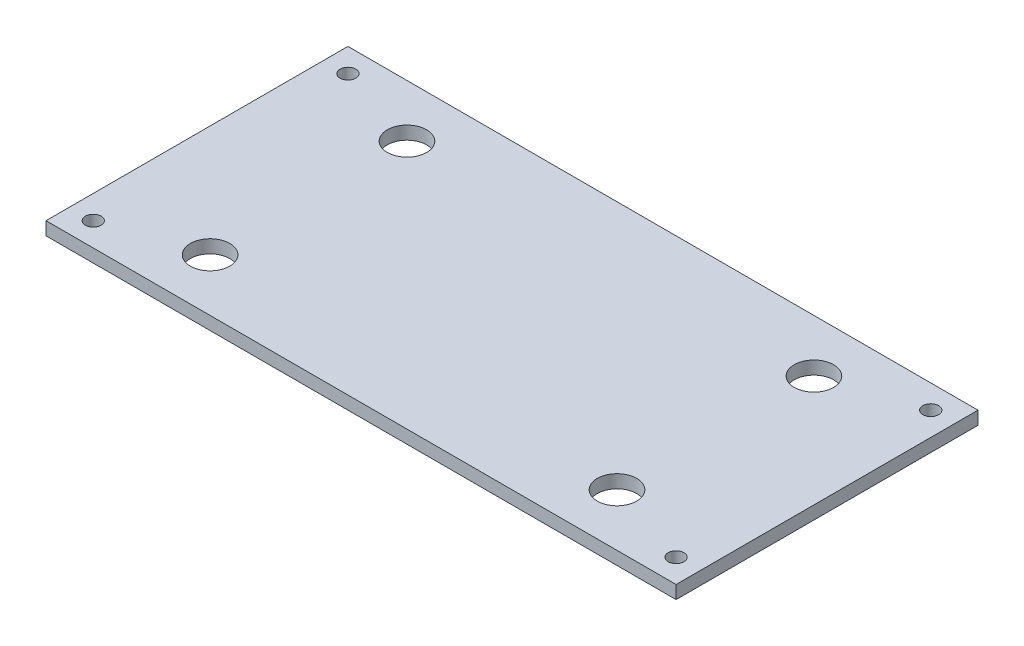
ISO-10303-21;
HEADER;
FILE_DESCRIPTION(('STEP AP214'),'2;1');
FILE_NAME('part.step','',(''),(''),'','','');
FILE_SCHEMA(('AUTOMOTIVE_DESIGN { 1 0 10303 214 1 1 1 1 }'));
ENDSEC;
DATA;
#1=APPLICATION_CONTEXT('core data for automotive mechanical design processes');
#2=APPLICATION_PROTOCOL_DEFINITION('international standard','automotive_design',2000,#1);
#3=PRODUCT_CONTEXT('',#1,'mechanical');
#4=PRODUCT('Part','Part','',(#3));
#5=PRODUCT_RELATED_PRODUCT_CATEGORY('part','',(#4));
#6=PRODUCT_DEFINITION_FORMATION('','',#4);
#7=PRODUCT_DEFINITION_CONTEXT('part definition',#1,'design');
#8=PRODUCT_DEFINITION('design','',#6,#7);
#9=PRODUCT_DEFINITION_SHAPE('','',#8);
#10=(LENGTH_UNIT() NAMED_UNIT(*) SI_UNIT(.MILLI.,.METRE.));
#11=(NAMED_UNIT(*) PLANE_ANGLE_UNIT() SI_UNIT($,.RADIAN.));
#12=(NAMED_UNIT(*) SI_UNIT($,.STERADIAN.) SOLID_ANGLE_UNIT());
#13=UNCERTAINTY_MEASURE_WITH_UNIT(LENGTH_MEASURE(1.E-05),#10,'distance_accuracy_value','');
#14=(GEOMETRIC_REPRESENTATION_CONTEXT(3) GLOBAL_UNCERTAINTY_ASSIGNED_CONTEXT((#13)) GLOBAL_UNIT_ASSIGNED_CONTEXT((#10,
#11,#12)) REPRESENTATION_CONTEXT('',''));
#15=CARTESIAN_POINT('',(0.,0.,0.));
#16=DIRECTION('',(0.,0.,1.));
#17=DIRECTION('',(1.,0.,0.));
#18=AXIS2_PLACEMENT_3D('',#15,#16,#17);
#19=CARTESIAN_POINT('',(0.,0.,0.));
#20=DIRECTION('',(0.,1.,0.));
#21=DIRECTION('',(0.,0.,1.));
#22=AXIS2_PLACEMENT_3D('',#19,#20,#21);
#23=PLANE('',#22);
#24=CARTESIAN_POINT('',(15.5,0.,-7.50000000000001));
#25=DIRECTION('',(0.,1.,0.));
#26=DIRECTION('',(0.,0.,1.));
#27=AXIS2_PLACEMENT_3D('',#24,#25,#26);
#28=CIRCLE('',#27,1.5);
#29=CARTESIAN_POINT('',(15.5,0.,-6.00000000000001));
#30=VERTEX_POINT('',#29);
#31=EDGE_CURVE('E130',#30,#30,#28,.T.);
#32=ORIENTED_EDGE('',*,*,#31,.T.);
#33=EDGE_LOOP('',(#32));
#34=FACE_BOUND('',#33,.T.);
#35=CARTESIAN_POINT('',(15.5000000000001,0.,7.50000000000001));
#36=DIRECTION('',(0.,1.,0.));
#37=DIRECTION('',(0.,0.,1.));
#38=AXIS2_PLACEMENT_3D('',#35,#36,#37);
#39=CIRCLE('',#38,1.5);
#40=CARTESIAN_POINT('',(15.5000000000001,0.,9.00000000000001));
#41=VERTEX_POINT('',#40);
#42=EDGE_CURVE('E212',#41,#41,#39,.T.);
#43=ORIENTED_EDGE('',*,*,#42,.T.);
#44=EDGE_LOOP('',(#43));
#45=FACE_BOUND('',#44,.T.);
#46=CARTESIAN_POINT('',(-15.4999999999999,0.,7.5));
#47=DIRECTION('',(0.,1.,0.));
#48=DIRECTION('',(0.,0.,1.));
#49=AXIS2_PLACEMENT_3D('',#46,#47,#48);
#50=CIRCLE('',#49,1.5);
#51=CARTESIAN_POINT('',(-15.4999999999999,0.,9.));
#52=VERTEX_POINT('',#51);
#53=EDGE_CURVE('E214',#52,#52,#50,.T.);
#54=ORIENTED_EDGE('',*,*,#53,.T.);
#55=EDGE_LOOP('',(#54));
#56=FACE_BOUND('',#55,.T.);
#57=CARTESIAN_POINT('',(-15.5,0.,-7.5));
#58=DIRECTION('',(0.,1.,0.));
#59=DIRECTION('',(0.,0.,1.));
#60=AXIS2_PLACEMENT_3D('',#57,#58,#59);
#61=CIRCLE('',#60,1.5);
#62=CARTESIAN_POINT('',(-15.5,0.,-6.));
#63=VERTEX_POINT('',#62);
#64=EDGE_CURVE('E121',#63,#63,#61,.T.);
#65=ORIENTED_EDGE('',*,*,#64,.T.);
#66=EDGE_LOOP('',(#65));
#67=FACE_BOUND('',#66,.T.);
#68=DIRECTION('',(1.,0.,0.));
#69=VECTOR('',#68,1.);
#70=CARTESIAN_POINT('',(24.,0.,-11.5));
#71=LINE('',#70,#69);
#72=CARTESIAN_POINT('',(-24.,0.,-11.5));
#73=VERTEX_POINT('',#72);
#74=CARTESIAN_POINT('',(24.,0.,-11.5));
#75=VERTEX_POINT('',#74);
#76=EDGE_CURVE('E111',#73,#75,#71,.T.);
#77=ORIENTED_EDGE('',*,*,#76,.T.);
#78=DIRECTION('',(0.,0.,1.));
#79=VECTOR('',#78,1.);
#80=CARTESIAN_POINT('',(24.,0.,11.5));
#81=LINE('',#80,#79);
#82=CARTESIAN_POINT('',(24.,0.,11.5));
#83=VERTEX_POINT('',#82);
#84=EDGE_CURVE('E87',#75,#83,#81,.T.);
#85=ORIENTED_EDGE('',*,*,#84,.T.);
#86=DIRECTION('',(-1.,0.,0.));
#87=VECTOR('',#86,1.);
#88=CARTESIAN_POINT('',(24.,0.,11.5));
#89=LINE('',#88,#87);
#90=CARTESIAN_POINT('',(-24.,0.,11.5));
#91=VERTEX_POINT('',#90);
#92=EDGE_CURVE('E70',#83,#91,#89,.T.);
#93=ORIENTED_EDGE('',*,*,#92,.T.);
#94=DIRECTION('',(0.,0.,-1.));
#95=VECTOR('',#94,1.);
#96=CARTESIAN_POINT('',(-24.,0.,11.5));
#97=LINE('',#96,#95);
#98=EDGE_CURVE('E75',#91,#73,#97,.T.);
#99=ORIENTED_EDGE('',*,*,#98,.T.);
#100=EDGE_LOOP('',(#77,#85,#93,#99));
#101=FACE_BOUND('',#100,.T.);
#102=CARTESIAN_POINT('',(-22.2,0.,-9.70000000000001));
#103=DIRECTION('',(0.,1.,0.));
#104=DIRECTION('',(0.,0.,1.));
#105=AXIS2_PLACEMENT_3D('',#102,#103,#104);
#106=CIRCLE('',#105,0.6);
#107=CARTESIAN_POINT('',(-22.2,0.,-9.10000000000001));
#108=VERTEX_POINT('',#107);
#109=EDGE_CURVE('E84',#108,#108,#106,.T.);
#110=ORIENTED_EDGE('',*,*,#109,.T.);
#111=EDGE_LOOP('',(#110));
#112=FACE_BOUND('',#111,.T.);
#113=CARTESIAN_POINT('',(-22.2,0.,9.70000000000001));
#114=DIRECTION('',(0.,1.,0.));
#115=DIRECTION('',(0.,0.,1.));
#116=AXIS2_PLACEMENT_3D('',#113,#114,#115);
#117=CIRCLE('',#116,0.6);
#118=CARTESIAN_POINT('',(-22.2,0.,10.3));
#119=VERTEX_POINT('',#118);
#120=EDGE_CURVE('E114',#119,#119,#117,.T.);
#121=ORIENTED_EDGE('',*,*,#120,.T.);
#122=EDGE_LOOP('',(#121));
#123=FACE_BOUND('',#122,.T.);
#124=CARTESIAN_POINT('',(22.2,0.,9.70000000000001));
#125=DIRECTION('',(0.,1.,0.));
#126=DIRECTION('',(0.,0.,1.));
#127=AXIS2_PLACEMENT_3D('',#124,#125,#126);
#128=CIRCLE('',#127,0.6);
#129=CARTESIAN_POINT('',(22.2,0.,10.3));
#130=VERTEX_POINT('',#129);
#131=EDGE_CURVE('E116',#130,#130,#128,.T.);
#132=ORIENTED_EDGE('',*,*,#131,.T.);
#133=EDGE_LOOP('',(#132));
#134=FACE_BOUND('',#133,.T.);
#135=CARTESIAN_POINT('',(22.2,0.,-9.7));
#136=DIRECTION('',(0.,1.,0.));
#137=DIRECTION('',(0.,0.,1.));
#138=AXIS2_PLACEMENT_3D('',#135,#136,#137);
#139=CIRCLE('',#138,0.6);
#140=CARTESIAN_POINT('',(22.2,0.,-9.1));
#141=VERTEX_POINT('',#140);
#142=EDGE_CURVE('E35',#141,#141,#139,.T.);
#143=ORIENTED_EDGE('',*,*,#142,.T.);
#144=EDGE_LOOP('',(#143));
#145=FACE_BOUND('',#144,.T.);
#146=ADVANCED_FACE('F32',(#34,#45,#56,#67,#101,#112,#123,#134,#145),#23,.F.);
#147=CARTESIAN_POINT('',(22.2,0.,-9.7));
#148=DIRECTION('',(0.,1.,0.));
#149=DIRECTION('',(0.,0.,1.));
#150=AXIS2_PLACEMENT_3D('',#147,#148,#149);
#151=CYLINDRICAL_SURFACE('',#150,0.6);
#152=CARTESIAN_POINT('',(22.2,1.,-9.7));
#153=DIRECTION('',(0.,1.,0.));
#154=DIRECTION('',(0.,0.,1.));
#155=AXIS2_PLACEMENT_3D('',#152,#153,#154);
#156=CIRCLE('',#155,0.6);
#157=CARTESIAN_POINT('',(22.2,1.,-9.1));
#158=VERTEX_POINT('',#157);
#159=EDGE_CURVE('E108',#158,#158,#156,.F.);
#160=ORIENTED_EDGE('',*,*,#159,.F.);
#161=EDGE_LOOP('',(#160));
#162=FACE_BOUND('',#161,.T.);
#163=ORIENTED_EDGE('',*,*,#142,.F.);
#164=EDGE_LOOP('',(#163));
#165=FACE_BOUND('',#164,.T.);
#166=ADVANCED_FACE('F173',(#162,#165),#151,.F.);
#167=CARTESIAN_POINT('',(22.2,0.,9.70000000000001));
#168=DIRECTION('',(0.,1.,0.));
#169=DIRECTION('',(0.,0.,1.));
#170=AXIS2_PLACEMENT_3D('',#167,#168,#169);
#171=CYLINDRICAL_SURFACE('',#170,0.6);
#172=CARTESIAN_POINT('',(22.2,1.,9.70000000000001));
#173=DIRECTION('',(0.,1.,0.));
#174=DIRECTION('',(0.,0.,1.));
#175=AXIS2_PLACEMENT_3D('',#172,#173,#174);
#176=CIRCLE('',#175,0.6);
#177=CARTESIAN_POINT('',(22.2,1.,10.3));
#178=VERTEX_POINT('',#177);
#179=EDGE_CURVE('E105',#178,#178,#176,.F.);
#180=ORIENTED_EDGE('',*,*,#179,.F.);
#181=EDGE_LOOP('',(#180));
#182=FACE_BOUND('',#181,.T.);
#183=ORIENTED_EDGE('',*,*,#131,.F.);
#184=EDGE_LOOP('',(#183));
#185=FACE_BOUND('',#184,.T.);
#186=ADVANCED_FACE('F170',(#182,#185),#171,.F.);
#187=CARTESIAN_POINT('',(-22.2,0.,9.70000000000001));
#188=DIRECTION('',(0.,1.,0.));
#189=DIRECTION('',(0.,0.,1.));
#190=AXIS2_PLACEMENT_3D('',#187,#188,#189);
#191=CYLINDRICAL_SURFACE('',#190,0.6);
#192=CARTESIAN_POINT('',(-22.2,1.,9.70000000000001));
#193=DIRECTION('',(0.,1.,0.));
#194=DIRECTION('',(0.,0.,1.));
#195=AXIS2_PLACEMENT_3D('',#192,#193,#194);
#196=CIRCLE('',#195,0.6);
#197=CARTESIAN_POINT('',(-22.2,1.,10.3));
#198=VERTEX_POINT('',#197);
#199=EDGE_CURVE('E102',#198,#198,#196,.F.);
#200=ORIENTED_EDGE('',*,*,#199,.F.);
#201=EDGE_LOOP('',(#200));
#202=FACE_BOUND('',#201,.T.);
#203=ORIENTED_EDGE('',*,*,#120,.F.);
#204=EDGE_LOOP('',(#203));
#205=FACE_BOUND('',#204,.T.);
#206=ADVANCED_FACE('F166',(#202,#205),#191,.F.);
#207=CARTESIAN_POINT('',(-22.2,0.,-9.70000000000001));
#208=DIRECTION('',(0.,1.,0.));
#209=DIRECTION('',(0.,0.,1.));
#210=AXIS2_PLACEMENT_3D('',#207,#208,#209);
#211=CYLINDRICAL_SURFACE('',#210,0.6);
#212=CARTESIAN_POINT('',(-22.2,1.,-9.70000000000001));
#213=DIRECTION('',(0.,1.,0.));
#214=DIRECTION('',(0.,0.,1.));
#215=AXIS2_PLACEMENT_3D('',#212,#213,#214);
#216=CIRCLE('',#215,0.6);
#217=CARTESIAN_POINT('',(-22.2,1.,-9.10000000000001));
#218=VERTEX_POINT('',#217);
#219=EDGE_CURVE('E98',#218,#218,#216,.F.);
#220=ORIENTED_EDGE('',*,*,#219,.F.);
#221=EDGE_LOOP('',(#220));
#222=FACE_BOUND('',#221,.T.);
#223=ORIENTED_EDGE('',*,*,#109,.F.);
#224=EDGE_LOOP('',(#223));
#225=FACE_BOUND('',#224,.T.);
#226=ADVANCED_FACE('F163',(#222,#225),#211,.F.);
#227=CARTESIAN_POINT('',(-24.,1.,11.5));
#228=DIRECTION('',(1.,0.,0.));
#229=DIRECTION('',(0.,0.,-1.));
#230=AXIS2_PLACEMENT_3D('',#227,#228,#229);
#231=PLANE('',#230);
#232=DIRECTION('',(0.,1.,0.));
#233=VECTOR('',#232,1.);
#234=CARTESIAN_POINT('',(-24.,1.,11.5));
#235=LINE('',#234,#233);
#236=CARTESIAN_POINT('',(-24.,1.,11.5));
#237=VERTEX_POINT('',#236);
#238=EDGE_CURVE('E77',#91,#237,#235,.T.);
#239=ORIENTED_EDGE('',*,*,#238,.T.);
#240=DIRECTION('',(0.,0.,1.));
#241=VECTOR('',#240,1.);
#242=CARTESIAN_POINT('',(-24.,1.,0.));
#243=LINE('',#242,#241);
#244=CARTESIAN_POINT('',(-24.,1.,-11.5));
#245=VERTEX_POINT('',#244);
#246=EDGE_CURVE('E101',#245,#237,#243,.T.);
#247=ORIENTED_EDGE('',*,*,#246,.F.);
#248=DIRECTION('',(0.,1.,0.));
#249=VECTOR('',#248,1.);
#250=CARTESIAN_POINT('',(-24.,1.,-11.5));
#251=LINE('',#250,#249);
#252=EDGE_CURVE('E80',#245,#73,#251,.F.);
#253=ORIENTED_EDGE('',*,*,#252,.T.);
#254=ORIENTED_EDGE('',*,*,#98,.F.);
#255=EDGE_LOOP('',(#239,#247,#253,#254));
#256=FACE_BOUND('',#255,.T.);
#257=ADVANCED_FACE('F76',(#256),#231,.F.);
#258=CARTESIAN_POINT('',(24.,1.,11.5));
#259=DIRECTION('',(0.,0.,-1.));
#260=DIRECTION('',(-1.,0.,0.));
#261=AXIS2_PLACEMENT_3D('',#258,#259,#260);
#262=PLANE('',#261);
#263=DIRECTION('',(0.,1.,0.));
#264=VECTOR('',#263,1.);
#265=CARTESIAN_POINT('',(24.,1.,11.5));
#266=LINE('',#265,#264);
#267=CARTESIAN_POINT('',(24.,1.,11.5));
#268=VERTEX_POINT('',#267);
#269=EDGE_CURVE('E89',#83,#268,#266,.T.);
#270=ORIENTED_EDGE('',*,*,#269,.T.);
#271=DIRECTION('',(1.,0.,0.));
#272=VECTOR('',#271,1.);
#273=CARTESIAN_POINT('',(0.,1.,11.5));
#274=LINE('',#273,#272);
#275=EDGE_CURVE('E93',#237,#268,#274,.T.);
#276=ORIENTED_EDGE('',*,*,#275,.F.);
#277=ORIENTED_EDGE('',*,*,#238,.F.);
#278=ORIENTED_EDGE('',*,*,#92,.F.);
#279=EDGE_LOOP('',(#270,#276,#277,#278));
#280=FACE_BOUND('',#279,.T.);
#281=ADVANCED_FACE('F91',(#280),#262,.F.);
#282=CARTESIAN_POINT('',(24.,1.,11.5));
#283=DIRECTION('',(-1.,0.,0.));
#284=DIRECTION('',(0.,0.,1.));
#285=AXIS2_PLACEMENT_3D('',#282,#283,#284);
#286=PLANE('',#285);
#287=DIRECTION('',(0.,1.,0.));
#288=VECTOR('',#287,1.);
#289=CARTESIAN_POINT('',(24.,1.,-11.5));
#290=LINE('',#289,#288);
#291=CARTESIAN_POINT('',(24.,1.,-11.5));
#292=VERTEX_POINT('',#291);
#293=EDGE_CURVE('E50',#75,#292,#290,.T.);
#294=ORIENTED_EDGE('',*,*,#293,.T.);
#295=DIRECTION('',(0.,0.,1.));
#296=VECTOR('',#295,1.);
#297=CARTESIAN_POINT('',(24.,1.,0.));
#298=LINE('',#297,#296);
#299=EDGE_CURVE('E41',#268,#292,#298,.F.);
#300=ORIENTED_EDGE('',*,*,#299,.F.);
#301=ORIENTED_EDGE('',*,*,#269,.F.);
#302=ORIENTED_EDGE('',*,*,#84,.F.);
#303=EDGE_LOOP('',(#294,#300,#301,#302));
#304=FACE_BOUND('',#303,.T.);
#305=ADVANCED_FACE('F141',(#304),#286,.F.);
#306=CARTESIAN_POINT('',(24.,1.,-11.5));
#307=DIRECTION('',(0.,0.,1.));
#308=DIRECTION('',(1.,0.,0.));
#309=AXIS2_PLACEMENT_3D('',#306,#307,#308);
#310=PLANE('',#309);
#311=ORIENTED_EDGE('',*,*,#252,.F.);
#312=DIRECTION('',(1.,0.,0.));
#313=VECTOR('',#312,1.);
#314=CARTESIAN_POINT('',(0.,1.,-11.5));
#315=LINE('',#314,#313);
#316=EDGE_CURVE('E11',#292,#245,#315,.F.);
#317=ORIENTED_EDGE('',*,*,#316,.F.);
#318=ORIENTED_EDGE('',*,*,#293,.F.);
#319=ORIENTED_EDGE('',*,*,#76,.F.);
#320=EDGE_LOOP('',(#311,#317,#318,#319));
#321=FACE_BOUND('',#320,.T.);
#322=ADVANCED_FACE('F146',(#321),#310,.F.);
#323=CARTESIAN_POINT('',(0.,1.,0.));
#324=DIRECTION('',(0.,1.,0.));
#325=DIRECTION('',(0.,0.,1.));
#326=AXIS2_PLACEMENT_3D('',#323,#324,#325);
#327=PLANE('',#326);
#328=CARTESIAN_POINT('',(15.5,1.,-7.50000000000001));
#329=DIRECTION('',(0.,1.,0.));
#330=DIRECTION('',(0.,0.,1.));
#331=AXIS2_PLACEMENT_3D('',#328,#329,#330);
#332=CIRCLE('',#331,1.5);
#333=CARTESIAN_POINT('',(15.5,1.,-6.00000000000001));
#334=VERTEX_POINT('',#333);
#335=EDGE_CURVE('E210',#334,#334,#332,.T.);
#336=ORIENTED_EDGE('',*,*,#335,.F.);
#337=EDGE_LOOP('',(#336));
#338=FACE_BOUND('',#337,.T.);
#339=CARTESIAN_POINT('',(15.5000000000001,1.,7.50000000000001));
#340=DIRECTION('',(0.,1.,0.));
#341=DIRECTION('',(0.,0.,-1.));
#342=AXIS2_PLACEMENT_3D('',#339,#340,#341);
#343=CIRCLE('',#342,1.5);
#344=CARTESIAN_POINT('',(15.5000000000001,1.,6.00000000000001));
#345=VERTEX_POINT('',#344);
#346=EDGE_CURVE('E222',#345,#345,#343,.T.);
#347=ORIENTED_EDGE('',*,*,#346,.F.);
#348=EDGE_LOOP('',(#347));
#349=FACE_BOUND('',#348,.T.);
#350=CARTESIAN_POINT('',(-15.4999999999999,1.,7.5));
#351=DIRECTION('',(0.,1.,0.));
#352=DIRECTION('',(0.,0.,-1.));
#353=AXIS2_PLACEMENT_3D('',#350,#351,#352);
#354=CIRCLE('',#353,1.5);
#355=CARTESIAN_POINT('',(-15.4999999999999,1.,6.));
#356=VERTEX_POINT('',#355);
#357=EDGE_CURVE('E219',#356,#356,#354,.T.);
#358=ORIENTED_EDGE('',*,*,#357,.F.);
#359=EDGE_LOOP('',(#358));
#360=FACE_BOUND('',#359,.T.);
#361=CARTESIAN_POINT('',(-15.5,1.,-7.5));
#362=DIRECTION('',(0.,1.,0.));
#363=DIRECTION('',(0.,0.,1.));
#364=AXIS2_PLACEMENT_3D('',#361,#362,#363);
#365=CIRCLE('',#364,1.5);
#366=CARTESIAN_POINT('',(-15.5,1.,-6.));
#367=VERTEX_POINT('',#366);
#368=EDGE_CURVE('E125',#367,#367,#365,.T.);
#369=ORIENTED_EDGE('',*,*,#368,.F.);
#370=EDGE_LOOP('',(#369));
#371=FACE_BOUND('',#370,.T.);
#372=ORIENTED_EDGE('',*,*,#299,.T.);
#373=ORIENTED_EDGE('',*,*,#316,.T.);
#374=ORIENTED_EDGE('',*,*,#246,.T.);
#375=ORIENTED_EDGE('',*,*,#275,.T.);
#376=EDGE_LOOP('',(#372,#373,#374,#375));
#377=FACE_BOUND('',#376,.T.);
#378=ORIENTED_EDGE('',*,*,#219,.T.);
#379=EDGE_LOOP('',(#378));
#380=FACE_BOUND('',#379,.T.);
#381=ORIENTED_EDGE('',*,*,#199,.T.);
#382=EDGE_LOOP('',(#381));
#383=FACE_BOUND('',#382,.T.);
#384=ORIENTED_EDGE('',*,*,#179,.T.);
#385=EDGE_LOOP('',(#384));
#386=FACE_BOUND('',#385,.T.);
#387=ORIENTED_EDGE('',*,*,#159,.T.);
#388=EDGE_LOOP('',(#387));
#389=FACE_BOUND('',#388,.T.);
#390=ADVANCED_FACE('F143',(#338,#349,#360,#371,#377,#380,#383,#386,#389),#327,.T.);
#391=CARTESIAN_POINT('',(-15.5,-9.,-7.5));
#392=DIRECTION('',(0.,1.,0.));
#393=DIRECTION('',(0.,0.,1.));
#394=AXIS2_PLACEMENT_3D('',#391,#392,#393);
#395=CYLINDRICAL_SURFACE('',#394,1.5);
#396=ORIENTED_EDGE('',*,*,#368,.T.);
#397=EDGE_LOOP('',(#396));
#398=FACE_BOUND('',#397,.T.);
#399=ORIENTED_EDGE('',*,*,#64,.F.);
#400=EDGE_LOOP('',(#399));
#401=FACE_BOUND('',#400,.T.);
#402=ADVANCED_FACE('F153',(#398,#401),#395,.F.);
#403=CARTESIAN_POINT('',(-15.4999999999999,-9.,7.5));
#404=DIRECTION('',(0.,1.,0.));
#405=DIRECTION('',(0.,0.,1.));
#406=AXIS2_PLACEMENT_3D('',#403,#404,#405);
#407=CYLINDRICAL_SURFACE('',#406,1.5);
#408=ORIENTED_EDGE('',*,*,#357,.T.);
#409=EDGE_LOOP('',(#408));
#410=FACE_BOUND('',#409,.T.);
#411=ORIENTED_EDGE('',*,*,#53,.F.);
#412=EDGE_LOOP('',(#411));
#413=FACE_BOUND('',#412,.T.);
#414=ADVANCED_FACE('F189',(#410,#413),#407,.F.);
#415=CARTESIAN_POINT('',(15.5000000000001,-9.,7.50000000000001));
#416=DIRECTION('',(0.,1.,0.));
#417=DIRECTION('',(0.,0.,1.));
#418=AXIS2_PLACEMENT_3D('',#415,#416,#417);
#419=CYLINDRICAL_SURFACE('',#418,1.5);
#420=ORIENTED_EDGE('',*,*,#346,.T.);
#421=EDGE_LOOP('',(#420));
#422=FACE_BOUND('',#421,.T.);
#423=ORIENTED_EDGE('',*,*,#42,.F.);
#424=EDGE_LOOP('',(#423));
#425=FACE_BOUND('',#424,.T.);
#426=ADVANCED_FACE('F194',(#422,#425),#419,.F.);
#427=CARTESIAN_POINT('',(15.5,-9.,-7.50000000000001));
#428=DIRECTION('',(0.,1.,0.));
#429=DIRECTION('',(0.,0.,1.));
#430=AXIS2_PLACEMENT_3D('',#427,#428,#429);
#431=CYLINDRICAL_SURFACE('',#430,1.5);
#432=ORIENTED_EDGE('',*,*,#335,.T.);
#433=EDGE_LOOP('',(#432));
#434=FACE_BOUND('',#433,.T.);
#435=ORIENTED_EDGE('',*,*,#31,.F.);
#436=EDGE_LOOP('',(#435));
#437=FACE_BOUND('',#436,.T.);
#438=ADVANCED_FACE('F201',(#434,#437),#431,.F.);
#439=CLOSED_SHELL('',(#146,#166,#186,#206,#226,#257,#281,#305,#322,#390,#402,#414,#426,#438));
#440=MANIFOLD_SOLID_BREP('B2',#439);
#441=ADVANCED_BREP_SHAPE_REPRESENTATION('',(#18,#440),#14);
#442=SHAPE_DEFINITION_REPRESENTATION(#9,#441);
ENDSEC;
END-ISO-10303-21;
